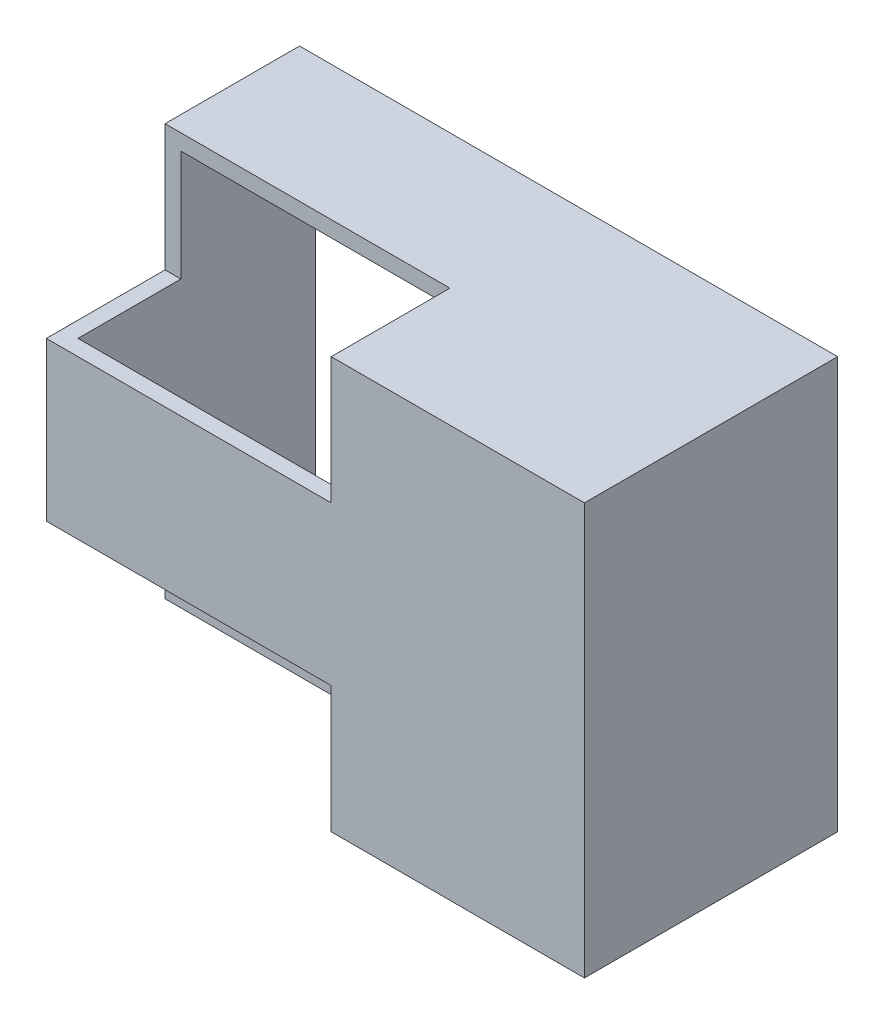
ISO-10303-21;
HEADER;
FILE_DESCRIPTION(('STEP AP214'),'2;1');
FILE_NAME('part.step','',(''),(''),'','','');
FILE_SCHEMA(('AUTOMOTIVE_DESIGN { 1 0 10303 214 1 1 1 1 }'));
ENDSEC;
DATA;
#1=APPLICATION_CONTEXT('core data for automotive mechanical design processes');
#2=APPLICATION_PROTOCOL_DEFINITION('international standard','automotive_design',2000,#1);
#3=PRODUCT_CONTEXT('',#1,'mechanical');
#4=PRODUCT('Part','Part','',(#3));
#5=PRODUCT_RELATED_PRODUCT_CATEGORY('part','',(#4));
#6=PRODUCT_DEFINITION_FORMATION('','',#4);
#7=PRODUCT_DEFINITION_CONTEXT('part definition',#1,'design');
#8=PRODUCT_DEFINITION('design','',#6,#7);
#9=PRODUCT_DEFINITION_SHAPE('','',#8);
#10=(LENGTH_UNIT() NAMED_UNIT(*) SI_UNIT(.MILLI.,.METRE.));
#11=(NAMED_UNIT(*) PLANE_ANGLE_UNIT() SI_UNIT($,.RADIAN.));
#12=(NAMED_UNIT(*) SI_UNIT($,.STERADIAN.) SOLID_ANGLE_UNIT());
#13=UNCERTAINTY_MEASURE_WITH_UNIT(LENGTH_MEASURE(1.E-05),#10,'distance_accuracy_value','');
#14=(GEOMETRIC_REPRESENTATION_CONTEXT(3) GLOBAL_UNCERTAINTY_ASSIGNED_CONTEXT((#13)) GLOBAL_UNIT_ASSIGNED_CONTEXT((#10,
#11,#12)) REPRESENTATION_CONTEXT('',''));
#15=CARTESIAN_POINT('',(0.,0.,0.));
#16=DIRECTION('',(0.,0.,1.));
#17=DIRECTION('',(1.,0.,0.));
#18=AXIS2_PLACEMENT_3D('',#15,#16,#17);
#19=CARTESIAN_POINT('',(43.18,33.02,40.64));
#20=DIRECTION('',(-1.,0.,0.));
#21=DIRECTION('',(0.,-1.,0.));
#22=AXIS2_PLACEMENT_3D('',#19,#20,#21);
#23=PLANE('',#22);
#24=DIRECTION('',(0.,1.,0.));
#25=VECTOR('',#24,1.);
#26=CARTESIAN_POINT('',(43.18,33.02,0.));
#27=LINE('',#26,#25);
#28=CARTESIAN_POINT('',(43.18,-33.02,0.));
#29=VERTEX_POINT('',#28);
#30=CARTESIAN_POINT('',(43.18,33.02,0.));
#31=VERTEX_POINT('',#30);
#32=EDGE_CURVE('E284',#29,#31,#27,.T.);
#33=ORIENTED_EDGE('',*,*,#32,.T.);
#34=DIRECTION('',(0.,0.,-1.));
#35=VECTOR('',#34,1.);
#36=CARTESIAN_POINT('',(43.18,33.02,40.64));
#37=LINE('',#36,#35);
#38=CARTESIAN_POINT('',(43.18,33.02,40.64));
#39=VERTEX_POINT('',#38);
#40=EDGE_CURVE('E185',#39,#31,#37,.T.);
#41=ORIENTED_EDGE('',*,*,#40,.F.);
#42=DIRECTION('',(0.,1.,0.));
#43=VECTOR('',#42,1.);
#44=CARTESIAN_POINT('',(43.18,33.02,40.64));
#45=LINE('',#44,#43);
#46=CARTESIAN_POINT('',(43.18,-33.02,40.64));
#47=VERTEX_POINT('',#46);
#48=EDGE_CURVE('E290',#47,#39,#45,.T.);
#49=ORIENTED_EDGE('',*,*,#48,.F.);
#50=DIRECTION('',(0.,0.,-1.));
#51=VECTOR('',#50,1.);
#52=CARTESIAN_POINT('',(43.18,-33.02,40.64));
#53=LINE('',#52,#51);
#54=EDGE_CURVE('E183',#47,#29,#53,.T.);
#55=ORIENTED_EDGE('',*,*,#54,.T.);
#56=EDGE_LOOP('',(#33,#41,#49,#55));
#57=FACE_BOUND('',#56,.T.);
#58=ADVANCED_FACE('F35',(#57),#23,.F.);
#59=CARTESIAN_POINT('',(-43.18,33.02,40.64));
#60=DIRECTION('',(0.,-1.,0.));
#61=DIRECTION('',(0.,0.,-1.));
#62=AXIS2_PLACEMENT_3D('',#59,#60,#61);
#63=PLANE('',#62);
#64=DIRECTION('',(-1.,0.,0.));
#65=VECTOR('',#64,1.);
#66=CARTESIAN_POINT('',(-43.18,33.02,21.59));
#67=LINE('',#66,#65);
#68=CARTESIAN_POINT('',(2.54000000000001,33.02,21.59));
#69=VERTEX_POINT('',#68);
#70=CARTESIAN_POINT('',(-43.18,33.02,21.59));
#71=VERTEX_POINT('',#70);
#72=EDGE_CURVE('E242',#69,#71,#67,.T.);
#73=ORIENTED_EDGE('',*,*,#72,.F.);
#74=DIRECTION('',(0.,0.,1.));
#75=VECTOR('',#74,1.);
#76=CARTESIAN_POINT('',(2.54000000000001,33.02,21.59));
#77=LINE('',#76,#75);
#78=CARTESIAN_POINT('',(2.54000000000001,33.02,40.64));
#79=VERTEX_POINT('',#78);
#80=EDGE_CURVE('E248',#69,#79,#77,.T.);
#81=ORIENTED_EDGE('',*,*,#80,.T.);
#82=DIRECTION('',(-1.,0.,0.));
#83=VECTOR('',#82,1.);
#84=CARTESIAN_POINT('',(-43.18,33.02,40.64));
#85=LINE('',#84,#83);
#86=EDGE_CURVE('E293',#39,#79,#85,.T.);
#87=ORIENTED_EDGE('',*,*,#86,.F.);
#88=ORIENTED_EDGE('',*,*,#40,.T.);
#89=DIRECTION('',(-1.,0.,0.));
#90=VECTOR('',#89,1.);
#91=CARTESIAN_POINT('',(-43.18,33.02,0.));
#92=LINE('',#91,#90);
#93=CARTESIAN_POINT('',(-43.18,33.02,0.));
#94=VERTEX_POINT('',#93);
#95=EDGE_CURVE('E303',#31,#94,#92,.T.);
#96=ORIENTED_EDGE('',*,*,#95,.T.);
#97=DIRECTION('',(0.,0.,-1.));
#98=VECTOR('',#97,1.);
#99=CARTESIAN_POINT('',(-43.18,33.02,40.64));
#100=LINE('',#99,#98);
#101=EDGE_CURVE('E182',#71,#94,#100,.T.);
#102=ORIENTED_EDGE('',*,*,#101,.F.);
#103=EDGE_LOOP('',(#73,#81,#87,#88,#96,#102));
#104=FACE_BOUND('',#103,.T.);
#105=ADVANCED_FACE('F316',(#104),#63,.F.);
#106=CARTESIAN_POINT('',(-43.18,33.02,40.64));
#107=DIRECTION('',(1.,0.,0.));
#108=DIRECTION('',(0.,1.,0.));
#109=AXIS2_PLACEMENT_3D('',#106,#107,#108);
#110=PLANE('',#109);
#111=DIRECTION('',(0.,-1.,0.));
#112=VECTOR('',#111,1.);
#113=CARTESIAN_POINT('',(-43.18,-33.02,21.59));
#114=LINE('',#113,#112);
#115=CARTESIAN_POINT('',(-43.18,-12.7,21.59));
#116=VERTEX_POINT('',#115);
#117=CARTESIAN_POINT('',(-43.18,-33.02,21.59));
#118=VERTEX_POINT('',#117);
#119=EDGE_CURVE('E158',#116,#118,#114,.T.);
#120=ORIENTED_EDGE('',*,*,#119,.F.);
#121=DIRECTION('',(0.,0.,1.));
#122=VECTOR('',#121,1.);
#123=CARTESIAN_POINT('',(-43.18,-12.7,21.59));
#124=LINE('',#123,#122);
#125=CARTESIAN_POINT('',(-43.18,-12.7,40.64));
#126=VERTEX_POINT('',#125);
#127=EDGE_CURVE('E222',#116,#126,#124,.T.);
#128=ORIENTED_EDGE('',*,*,#127,.T.);
#129=DIRECTION('',(0.,-1.,0.));
#130=VECTOR('',#129,1.);
#131=CARTESIAN_POINT('',(-43.18,33.02,40.64));
#132=LINE('',#131,#130);
#133=CARTESIAN_POINT('',(-43.18,12.7,40.64));
#134=VERTEX_POINT('',#133);
#135=EDGE_CURVE('E297',#134,#126,#132,.T.);
#136=ORIENTED_EDGE('',*,*,#135,.F.);
#137=DIRECTION('',(0.,0.,1.));
#138=VECTOR('',#137,1.);
#139=CARTESIAN_POINT('',(-43.18,12.7,21.59));
#140=LINE('',#139,#138);
#141=CARTESIAN_POINT('',(-43.18,12.7,21.59));
#142=VERTEX_POINT('',#141);
#143=EDGE_CURVE('E244',#142,#134,#140,.T.);
#144=ORIENTED_EDGE('',*,*,#143,.F.);
#145=DIRECTION('',(0.,-1.,0.));
#146=VECTOR('',#145,1.);
#147=CARTESIAN_POINT('',(-43.18,33.02,21.59));
#148=LINE('',#147,#146);
#149=EDGE_CURVE('E233',#71,#142,#148,.T.);
#150=ORIENTED_EDGE('',*,*,#149,.F.);
#151=ORIENTED_EDGE('',*,*,#101,.T.);
#152=DIRECTION('',(0.,-1.,0.));
#153=VECTOR('',#152,1.);
#154=CARTESIAN_POINT('',(-43.18,33.02,0.));
#155=LINE('',#154,#153);
#156=CARTESIAN_POINT('',(-43.18,-33.02,0.));
#157=VERTEX_POINT('',#156);
#158=EDGE_CURVE('E180',#94,#157,#155,.T.);
#159=ORIENTED_EDGE('',*,*,#158,.T.);
#160=DIRECTION('',(0.,0.,-1.));
#161=VECTOR('',#160,1.);
#162=CARTESIAN_POINT('',(-43.18,-33.02,40.64));
#163=LINE('',#162,#161);
#164=EDGE_CURVE('E174',#118,#157,#163,.T.);
#165=ORIENTED_EDGE('',*,*,#164,.F.);
#166=EDGE_LOOP('',(#120,#128,#136,#144,#150,#151,#159,#165));
#167=FACE_BOUND('',#166,.T.);
#168=ADVANCED_FACE('F178',(#167),#110,.F.);
#169=CARTESIAN_POINT('',(-43.18,-33.02,40.64));
#170=DIRECTION('',(0.,1.,0.));
#171=DIRECTION('',(0.,0.,1.));
#172=AXIS2_PLACEMENT_3D('',#169,#170,#171);
#173=PLANE('',#172);
#174=DIRECTION('',(1.,0.,0.));
#175=VECTOR('',#174,1.);
#176=CARTESIAN_POINT('',(-43.18,-33.02,40.64));
#177=LINE('',#176,#175);
#178=CARTESIAN_POINT('',(2.54000000000001,-33.02,40.64));
#179=VERTEX_POINT('',#178);
#180=EDGE_CURVE('E188',#179,#47,#177,.T.);
#181=ORIENTED_EDGE('',*,*,#180,.F.);
#182=DIRECTION('',(0.,0.,1.));
#183=VECTOR('',#182,1.);
#184=CARTESIAN_POINT('',(2.54000000000001,-33.02,21.59));
#185=LINE('',#184,#183);
#186=CARTESIAN_POINT('',(2.54000000000001,-33.02,21.59));
#187=VERTEX_POINT('',#186);
#188=EDGE_CURVE('E49',#187,#179,#185,.T.);
#189=ORIENTED_EDGE('',*,*,#188,.F.);
#190=DIRECTION('',(1.,0.,0.));
#191=VECTOR('',#190,1.);
#192=CARTESIAN_POINT('',(-43.18,-33.02,21.59));
#193=LINE('',#192,#191);
#194=EDGE_CURVE('E162',#118,#187,#193,.T.);
#195=ORIENTED_EDGE('',*,*,#194,.F.);
#196=ORIENTED_EDGE('',*,*,#164,.T.);
#197=DIRECTION('',(1.,0.,0.));
#198=VECTOR('',#197,1.);
#199=CARTESIAN_POINT('',(-43.18,-33.02,0.));
#200=LINE('',#199,#198);
#201=EDGE_CURVE('E294',#157,#29,#200,.T.);
#202=ORIENTED_EDGE('',*,*,#201,.T.);
#203=ORIENTED_EDGE('',*,*,#54,.F.);
#204=EDGE_LOOP('',(#181,#189,#195,#196,#202,#203));
#205=FACE_BOUND('',#204,.T.);
#206=ADVANCED_FACE('F173',(#205),#173,.F.);
#207=CARTESIAN_POINT('',(0.,0.,40.64));
#208=DIRECTION('',(0.,0.,1.));
#209=DIRECTION('',(1.,0.,0.));
#210=AXIS2_PLACEMENT_3D('',#207,#208,#209);
#211=PLANE('',#210);
#212=DIRECTION('',(-1.,0.,0.));
#213=VECTOR('',#212,1.);
#214=CARTESIAN_POINT('',(-43.18,-12.7,40.64));
#215=LINE('',#214,#213);
#216=CARTESIAN_POINT('',(2.54000000000001,-12.7,40.64));
#217=VERTEX_POINT('',#216);
#218=EDGE_CURVE('E169',#217,#126,#215,.T.);
#219=ORIENTED_EDGE('',*,*,#218,.F.);
#220=DIRECTION('',(0.,1.,0.));
#221=VECTOR('',#220,1.);
#222=CARTESIAN_POINT('',(2.54000000000001,-33.02,40.64));
#223=LINE('',#222,#221);
#224=EDGE_CURVE('E322',#179,#217,#223,.T.);
#225=ORIENTED_EDGE('',*,*,#224,.F.);
#226=ORIENTED_EDGE('',*,*,#180,.T.);
#227=ORIENTED_EDGE('',*,*,#48,.T.);
#228=ORIENTED_EDGE('',*,*,#86,.T.);
#229=DIRECTION('',(0.,1.,0.));
#230=VECTOR('',#229,1.);
#231=CARTESIAN_POINT('',(2.54000000000001,33.02,40.64));
#232=LINE('',#231,#230);
#233=CARTESIAN_POINT('',(2.54000000000001,12.7,40.64));
#234=VERTEX_POINT('',#233);
#235=EDGE_CURVE('E237',#234,#79,#232,.T.);
#236=ORIENTED_EDGE('',*,*,#235,.F.);
#237=DIRECTION('',(1.,0.,0.));
#238=VECTOR('',#237,1.);
#239=CARTESIAN_POINT('',(-43.18,12.7,40.64));
#240=LINE('',#239,#238);
#241=EDGE_CURVE('E232',#134,#234,#240,.T.);
#242=ORIENTED_EDGE('',*,*,#241,.F.);
#243=ORIENTED_EDGE('',*,*,#135,.T.);
#244=EDGE_LOOP('',(#219,#225,#226,#227,#228,#236,#242,#243));
#245=FACE_BOUND('',#244,.T.);
#246=ADVANCED_FACE('F321',(#245),#211,.T.);
#247=CARTESIAN_POINT('',(0.,0.,0.));
#248=DIRECTION('',(0.,0.,1.));
#249=DIRECTION('',(1.,0.,0.));
#250=AXIS2_PLACEMENT_3D('',#247,#248,#249);
#251=PLANE('',#250);
#252=DIRECTION('',(1.,0.,0.));
#253=VECTOR('',#252,1.);
#254=CARTESIAN_POINT('',(40.64,30.48,0.));
#255=LINE('',#254,#253);
#256=CARTESIAN_POINT('',(-40.64,30.48,0.));
#257=VERTEX_POINT('',#256);
#258=CARTESIAN_POINT('',(40.64,30.48,0.));
#259=VERTEX_POINT('',#258);
#260=EDGE_CURVE('E274',#257,#259,#255,.T.);
#261=ORIENTED_EDGE('',*,*,#260,.F.);
#262=DIRECTION('',(0.,1.,0.));
#263=VECTOR('',#262,1.);
#264=CARTESIAN_POINT('',(-40.64,30.48,0.));
#265=LINE('',#264,#263);
#266=CARTESIAN_POINT('',(-40.64,-30.48,0.));
#267=VERTEX_POINT('',#266);
#268=EDGE_CURVE('E262',#267,#257,#265,.T.);
#269=ORIENTED_EDGE('',*,*,#268,.F.);
#270=DIRECTION('',(-1.,0.,0.));
#271=VECTOR('',#270,1.);
#272=CARTESIAN_POINT('',(40.64,-30.48,0.));
#273=LINE('',#272,#271);
#274=CARTESIAN_POINT('',(40.64,-30.48,0.));
#275=VERTEX_POINT('',#274);
#276=EDGE_CURVE('E266',#275,#267,#273,.T.);
#277=ORIENTED_EDGE('',*,*,#276,.F.);
#278=DIRECTION('',(0.,-1.,0.));
#279=VECTOR('',#278,1.);
#280=CARTESIAN_POINT('',(40.64,30.48,0.));
#281=LINE('',#280,#279);
#282=EDGE_CURVE('E277',#259,#275,#281,.T.);
#283=ORIENTED_EDGE('',*,*,#282,.F.);
#284=EDGE_LOOP('',(#261,#269,#277,#283));
#285=FACE_BOUND('',#284,.T.);
#286=ORIENTED_EDGE('',*,*,#32,.F.);
#287=ORIENTED_EDGE('',*,*,#201,.F.);
#288=ORIENTED_EDGE('',*,*,#158,.F.);
#289=ORIENTED_EDGE('',*,*,#95,.F.);
#290=EDGE_LOOP('',(#286,#287,#288,#289));
#291=FACE_BOUND('',#290,.T.);
#292=ADVANCED_FACE('F312',(#285,#291),#251,.F.);
#293=CARTESIAN_POINT('',(-40.64,30.48,38.1));
#294=DIRECTION('',(-1.,0.,0.));
#295=DIRECTION('',(0.,-1.,0.));
#296=AXIS2_PLACEMENT_3D('',#293,#294,#295);
#297=PLANE('',#296);
#298=DIRECTION('',(0.,1.,0.));
#299=VECTOR('',#298,1.);
#300=CARTESIAN_POINT('',(-40.64,30.48,38.1));
#301=LINE('',#300,#299);
#302=CARTESIAN_POINT('',(-40.64,-12.7,38.1));
#303=VERTEX_POINT('',#302);
#304=CARTESIAN_POINT('',(-40.64,12.7,38.1));
#305=VERTEX_POINT('',#304);
#306=EDGE_CURVE('E263',#303,#305,#301,.T.);
#307=ORIENTED_EDGE('',*,*,#306,.F.);
#308=DIRECTION('',(0.,0.,-1.));
#309=VECTOR('',#308,1.);
#310=CARTESIAN_POINT('',(-40.64,-12.7,38.1));
#311=LINE('',#310,#309);
#312=CARTESIAN_POINT('',(-40.64,-12.7,21.59));
#313=VERTEX_POINT('',#312);
#314=EDGE_CURVE('E208',#303,#313,#311,.T.);
#315=ORIENTED_EDGE('',*,*,#314,.T.);
#316=DIRECTION('',(0.,-1.,0.));
#317=VECTOR('',#316,1.);
#318=CARTESIAN_POINT('',(-40.64,30.48,21.59));
#319=LINE('',#318,#317);
#320=CARTESIAN_POINT('',(-40.64,-30.48,21.59));
#321=VERTEX_POINT('',#320);
#322=EDGE_CURVE('E224',#313,#321,#319,.T.);
#323=ORIENTED_EDGE('',*,*,#322,.T.);
#324=DIRECTION('',(0.,0.,-1.));
#325=VECTOR('',#324,1.);
#326=CARTESIAN_POINT('',(-40.64,-30.48,38.1));
#327=LINE('',#326,#325);
#328=EDGE_CURVE('E282',#321,#267,#327,.T.);
#329=ORIENTED_EDGE('',*,*,#328,.T.);
#330=ORIENTED_EDGE('',*,*,#268,.T.);
#331=DIRECTION('',(0.,0.,-1.));
#332=VECTOR('',#331,1.);
#333=CARTESIAN_POINT('',(-40.64,30.48,38.1));
#334=LINE('',#333,#332);
#335=CARTESIAN_POINT('',(-40.64,30.48,21.59));
#336=VERTEX_POINT('',#335);
#337=EDGE_CURVE('E271',#336,#257,#334,.T.);
#338=ORIENTED_EDGE('',*,*,#337,.F.);
#339=DIRECTION('',(0.,1.,0.));
#340=VECTOR('',#339,1.);
#341=CARTESIAN_POINT('',(-40.64,30.48,21.59));
#342=LINE('',#341,#340);
#343=CARTESIAN_POINT('',(-40.64,12.7,21.59));
#344=VERTEX_POINT('',#343);
#345=EDGE_CURVE('E260',#344,#336,#342,.T.);
#346=ORIENTED_EDGE('',*,*,#345,.F.);
#347=DIRECTION('',(0.,0.,1.));
#348=VECTOR('',#347,1.);
#349=CARTESIAN_POINT('',(-40.64,12.7,38.1));
#350=LINE('',#349,#348);
#351=EDGE_CURVE('E251',#344,#305,#350,.T.);
#352=ORIENTED_EDGE('',*,*,#351,.T.);
#353=EDGE_LOOP('',(#307,#315,#323,#329,#330,#338,#346,#352));
#354=FACE_BOUND('',#353,.T.);
#355=ADVANCED_FACE('F328',(#354),#297,.F.);
#356=CARTESIAN_POINT('',(40.64,-30.48,38.1));
#357=DIRECTION('',(0.,-1.,0.));
#358=DIRECTION('',(0.,0.,-1.));
#359=AXIS2_PLACEMENT_3D('',#356,#357,#358);
#360=PLANE('',#359);
#361=DIRECTION('',(1.,0.,0.));
#362=VECTOR('',#361,1.);
#363=CARTESIAN_POINT('',(40.64,-30.48,21.59));
#364=LINE('',#363,#362);
#365=CARTESIAN_POINT('',(2.54000000000001,-30.48,21.59));
#366=VERTEX_POINT('',#365);
#367=EDGE_CURVE('E11',#321,#366,#364,.T.);
#368=ORIENTED_EDGE('',*,*,#367,.T.);
#369=DIRECTION('',(0.,0.,1.));
#370=VECTOR('',#369,1.);
#371=CARTESIAN_POINT('',(2.54000000000002,-30.48,38.1));
#372=LINE('',#371,#370);
#373=CARTESIAN_POINT('',(2.54000000000001,-30.48,38.1));
#374=VERTEX_POINT('',#373);
#375=EDGE_CURVE('E218',#366,#374,#372,.T.);
#376=ORIENTED_EDGE('',*,*,#375,.T.);
#377=DIRECTION('',(-1.,0.,0.));
#378=VECTOR('',#377,1.);
#379=CARTESIAN_POINT('',(40.64,-30.48,38.1));
#380=LINE('',#379,#378);
#381=CARTESIAN_POINT('',(40.64,-30.48,38.1));
#382=VERTEX_POINT('',#381);
#383=EDGE_CURVE('E215',#382,#374,#380,.T.);
#384=ORIENTED_EDGE('',*,*,#383,.F.);
#385=DIRECTION('',(0.,0.,-1.));
#386=VECTOR('',#385,1.);
#387=CARTESIAN_POINT('',(40.64,-30.48,38.1));
#388=LINE('',#387,#386);
#389=EDGE_CURVE('E285',#382,#275,#388,.T.);
#390=ORIENTED_EDGE('',*,*,#389,.T.);
#391=ORIENTED_EDGE('',*,*,#276,.T.);
#392=ORIENTED_EDGE('',*,*,#328,.F.);
#393=EDGE_LOOP('',(#368,#376,#384,#390,#391,#392));
#394=FACE_BOUND('',#393,.T.);
#395=ADVANCED_FACE('F220',(#394),#360,.F.);
#396=CARTESIAN_POINT('',(40.64,30.48,38.1));
#397=DIRECTION('',(1.,0.,0.));
#398=DIRECTION('',(0.,1.,0.));
#399=AXIS2_PLACEMENT_3D('',#396,#397,#398);
#400=PLANE('',#399);
#401=ORIENTED_EDGE('',*,*,#282,.T.);
#402=ORIENTED_EDGE('',*,*,#389,.F.);
#403=DIRECTION('',(0.,-1.,0.));
#404=VECTOR('',#403,1.);
#405=CARTESIAN_POINT('',(40.64,30.48,38.1));
#406=LINE('',#405,#404);
#407=CARTESIAN_POINT('',(40.64,30.48,38.1));
#408=VERTEX_POINT('',#407);
#409=EDGE_CURVE('E268',#408,#382,#406,.T.);
#410=ORIENTED_EDGE('',*,*,#409,.F.);
#411=DIRECTION('',(0.,0.,-1.));
#412=VECTOR('',#411,1.);
#413=CARTESIAN_POINT('',(40.64,30.48,38.1));
#414=LINE('',#413,#412);
#415=EDGE_CURVE('E287',#408,#259,#414,.T.);
#416=ORIENTED_EDGE('',*,*,#415,.T.);
#417=EDGE_LOOP('',(#401,#402,#410,#416));
#418=FACE_BOUND('',#417,.T.);
#419=ADVANCED_FACE('F356',(#418),#400,.F.);
#420=CARTESIAN_POINT('',(40.64,30.48,38.1));
#421=DIRECTION('',(0.,1.,0.));
#422=DIRECTION('',(0.,0.,1.));
#423=AXIS2_PLACEMENT_3D('',#420,#421,#422);
#424=PLANE('',#423);
#425=DIRECTION('',(1.,0.,0.));
#426=VECTOR('',#425,1.);
#427=CARTESIAN_POINT('',(40.64,30.48,38.1));
#428=LINE('',#427,#426);
#429=CARTESIAN_POINT('',(2.54000000000001,30.48,38.1));
#430=VERTEX_POINT('',#429);
#431=EDGE_CURVE('E265',#430,#408,#428,.T.);
#432=ORIENTED_EDGE('',*,*,#431,.F.);
#433=DIRECTION('',(0.,0.,-1.));
#434=VECTOR('',#433,1.);
#435=CARTESIAN_POINT('',(2.54000000000001,30.48,38.1));
#436=LINE('',#435,#434);
#437=CARTESIAN_POINT('',(2.54000000000001,30.48,21.59));
#438=VERTEX_POINT('',#437);
#439=EDGE_CURVE('E257',#430,#438,#436,.T.);
#440=ORIENTED_EDGE('',*,*,#439,.T.);
#441=DIRECTION('',(1.,0.,0.));
#442=VECTOR('',#441,1.);
#443=CARTESIAN_POINT('',(40.64,30.48,21.59));
#444=LINE('',#443,#442);
#445=EDGE_CURVE('E200',#336,#438,#444,.T.);
#446=ORIENTED_EDGE('',*,*,#445,.F.);
#447=ORIENTED_EDGE('',*,*,#337,.T.);
#448=ORIENTED_EDGE('',*,*,#260,.T.);
#449=ORIENTED_EDGE('',*,*,#415,.F.);
#450=EDGE_LOOP('',(#432,#440,#446,#447,#448,#449));
#451=FACE_BOUND('',#450,.T.);
#452=ADVANCED_FACE('F339',(#451),#424,.F.);
#453=CARTESIAN_POINT('',(0.,0.,38.1));
#454=DIRECTION('',(0.,0.,-1.));
#455=DIRECTION('',(-1.,0.,0.));
#456=AXIS2_PLACEMENT_3D('',#453,#454,#455);
#457=PLANE('',#456);
#458=DIRECTION('',(1.,0.,0.));
#459=VECTOR('',#458,1.);
#460=CARTESIAN_POINT('',(0.,-12.7,38.1));
#461=LINE('',#460,#459);
#462=CARTESIAN_POINT('',(2.54000000000001,-12.7,38.1));
#463=VERTEX_POINT('',#462);
#464=EDGE_CURVE('E42',#303,#463,#461,.T.);
#465=ORIENTED_EDGE('',*,*,#464,.F.);
#466=ORIENTED_EDGE('',*,*,#306,.T.);
#467=DIRECTION('',(-1.,0.,0.));
#468=VECTOR('',#467,1.);
#469=CARTESIAN_POINT('',(0.,12.7,38.1));
#470=LINE('',#469,#468);
#471=CARTESIAN_POINT('',(2.54000000000001,12.7,38.1));
#472=VERTEX_POINT('',#471);
#473=EDGE_CURVE('E194',#472,#305,#470,.T.);
#474=ORIENTED_EDGE('',*,*,#473,.F.);
#475=DIRECTION('',(0.,-1.,0.));
#476=VECTOR('',#475,1.);
#477=CARTESIAN_POINT('',(2.54000000000001,0.,38.1));
#478=LINE('',#477,#476);
#479=EDGE_CURVE('E197',#430,#472,#478,.T.);
#480=ORIENTED_EDGE('',*,*,#479,.F.);
#481=ORIENTED_EDGE('',*,*,#431,.T.);
#482=ORIENTED_EDGE('',*,*,#409,.T.);
#483=ORIENTED_EDGE('',*,*,#383,.T.);
#484=DIRECTION('',(0.,-1.,0.));
#485=VECTOR('',#484,1.);
#486=CARTESIAN_POINT('',(2.54000000000001,0.,38.1));
#487=LINE('',#486,#485);
#488=EDGE_CURVE('E202',#463,#374,#487,.T.);
#489=ORIENTED_EDGE('',*,*,#488,.F.);
#490=EDGE_LOOP('',(#465,#466,#474,#480,#481,#482,#483,#489));
#491=FACE_BOUND('',#490,.T.);
#492=ADVANCED_FACE('F212',(#491),#457,.T.);
#493=CARTESIAN_POINT('',(0.,0.,21.59));
#494=DIRECTION('',(0.,0.,1.));
#495=DIRECTION('',(1.,0.,0.));
#496=AXIS2_PLACEMENT_3D('',#493,#494,#495);
#497=PLANE('',#496);
#498=ORIENTED_EDGE('',*,*,#345,.T.);
#499=ORIENTED_EDGE('',*,*,#445,.T.);
#500=DIRECTION('',(0.,1.,0.));
#501=VECTOR('',#500,1.);
#502=CARTESIAN_POINT('',(2.54000000000001,33.02,21.59));
#503=LINE('',#502,#501);
#504=EDGE_CURVE('E240',#438,#69,#503,.T.);
#505=ORIENTED_EDGE('',*,*,#504,.T.);
#506=ORIENTED_EDGE('',*,*,#72,.T.);
#507=ORIENTED_EDGE('',*,*,#149,.T.);
#508=DIRECTION('',(1.,0.,0.));
#509=VECTOR('',#508,1.);
#510=CARTESIAN_POINT('',(-43.18,12.7,21.59));
#511=LINE('',#510,#509);
#512=EDGE_CURVE('E236',#142,#344,#511,.T.);
#513=ORIENTED_EDGE('',*,*,#512,.T.);
#514=EDGE_LOOP('',(#498,#499,#505,#506,#507,#513));
#515=FACE_BOUND('',#514,.T.);
#516=ADVANCED_FACE('F343',(#515),#497,.T.);
#517=CARTESIAN_POINT('',(2.54000000000001,33.02,21.59));
#518=DIRECTION('',(1.,0.,0.));
#519=DIRECTION('',(0.,1.,0.));
#520=AXIS2_PLACEMENT_3D('',#517,#518,#519);
#521=PLANE('',#520);
#522=ORIENTED_EDGE('',*,*,#479,.T.);
#523=DIRECTION('',(0.,0.,1.));
#524=VECTOR('',#523,1.);
#525=CARTESIAN_POINT('',(2.54000000000001,12.7,21.59));
#526=LINE('',#525,#524);
#527=EDGE_CURVE('E252',#472,#234,#526,.T.);
#528=ORIENTED_EDGE('',*,*,#527,.T.);
#529=ORIENTED_EDGE('',*,*,#235,.T.);
#530=ORIENTED_EDGE('',*,*,#80,.F.);
#531=ORIENTED_EDGE('',*,*,#504,.F.);
#532=ORIENTED_EDGE('',*,*,#439,.F.);
#533=EDGE_LOOP('',(#522,#528,#529,#530,#531,#532));
#534=FACE_BOUND('',#533,.T.);
#535=ADVANCED_FACE('F345',(#534),#521,.F.);
#536=CARTESIAN_POINT('',(-43.18,12.7,21.59));
#537=DIRECTION('',(0.,-1.,0.));
#538=DIRECTION('',(0.,0.,-1.));
#539=AXIS2_PLACEMENT_3D('',#536,#537,#538);
#540=PLANE('',#539);
#541=ORIENTED_EDGE('',*,*,#512,.F.);
#542=ORIENTED_EDGE('',*,*,#143,.T.);
#543=ORIENTED_EDGE('',*,*,#241,.T.);
#544=ORIENTED_EDGE('',*,*,#527,.F.);
#545=ORIENTED_EDGE('',*,*,#473,.T.);
#546=ORIENTED_EDGE('',*,*,#351,.F.);
#547=EDGE_LOOP('',(#541,#542,#543,#544,#545,#546));
#548=FACE_BOUND('',#547,.T.);
#549=ADVANCED_FACE('F352',(#548),#540,.F.);
#550=CARTESIAN_POINT('',(0.,0.,21.59));
#551=DIRECTION('',(0.,0.,-1.));
#552=DIRECTION('',(-1.,0.,0.));
#553=AXIS2_PLACEMENT_3D('',#550,#551,#552);
#554=PLANE('',#553);
#555=DIRECTION('',(-1.,0.,0.));
#556=VECTOR('',#555,1.);
#557=CARTESIAN_POINT('',(-43.18,-12.7,21.59));
#558=LINE('',#557,#556);
#559=EDGE_CURVE('E164',#313,#116,#558,.T.);
#560=ORIENTED_EDGE('',*,*,#559,.T.);
#561=ORIENTED_EDGE('',*,*,#119,.T.);
#562=ORIENTED_EDGE('',*,*,#194,.T.);
#563=DIRECTION('',(0.,1.,0.));
#564=VECTOR('',#563,1.);
#565=CARTESIAN_POINT('',(2.54000000000001,-33.02,21.59));
#566=LINE('',#565,#564);
#567=EDGE_CURVE('E176',#187,#366,#566,.T.);
#568=ORIENTED_EDGE('',*,*,#567,.T.);
#569=ORIENTED_EDGE('',*,*,#367,.F.);
#570=ORIENTED_EDGE('',*,*,#322,.F.);
#571=EDGE_LOOP('',(#560,#561,#562,#568,#569,#570));
#572=FACE_BOUND('',#571,.T.);
#573=ADVANCED_FACE('F160',(#572),#554,.F.);
#574=CARTESIAN_POINT('',(-43.18,-12.7,21.59));
#575=DIRECTION('',(0.,1.,0.));
#576=DIRECTION('',(0.,0.,1.));
#577=AXIS2_PLACEMENT_3D('',#574,#575,#576);
#578=PLANE('',#577);
#579=ORIENTED_EDGE('',*,*,#464,.T.);
#580=DIRECTION('',(0.,0.,1.));
#581=VECTOR('',#580,1.);
#582=CARTESIAN_POINT('',(2.54000000000001,-12.7,21.59));
#583=LINE('',#582,#581);
#584=EDGE_CURVE('E55',#463,#217,#583,.T.);
#585=ORIENTED_EDGE('',*,*,#584,.T.);
#586=ORIENTED_EDGE('',*,*,#218,.T.);
#587=ORIENTED_EDGE('',*,*,#127,.F.);
#588=ORIENTED_EDGE('',*,*,#559,.F.);
#589=ORIENTED_EDGE('',*,*,#314,.F.);
#590=EDGE_LOOP('',(#579,#585,#586,#587,#588,#589));
#591=FACE_BOUND('',#590,.T.);
#592=ADVANCED_FACE('F206',(#591),#578,.F.);
#593=CARTESIAN_POINT('',(2.54000000000001,-33.02,21.59));
#594=DIRECTION('',(1.,0.,0.));
#595=DIRECTION('',(0.,0.,-1.));
#596=AXIS2_PLACEMENT_3D('',#593,#594,#595);
#597=PLANE('',#596);
#598=ORIENTED_EDGE('',*,*,#567,.F.);
#599=ORIENTED_EDGE('',*,*,#188,.T.);
#600=ORIENTED_EDGE('',*,*,#224,.T.);
#601=ORIENTED_EDGE('',*,*,#584,.F.);
#602=ORIENTED_EDGE('',*,*,#488,.T.);
#603=ORIENTED_EDGE('',*,*,#375,.F.);
#604=EDGE_LOOP('',(#598,#599,#600,#601,#602,#603));
#605=FACE_BOUND('',#604,.T.);
#606=ADVANCED_FACE('F217',(#605),#597,.F.);
#607=CLOSED_SHELL('',(#58,#105,#168,#206,#246,#292,#355,#395,#419,#452,#492,#516,#535,#549,#573,
#592,#606));
#608=MANIFOLD_SOLID_BREP('B2',#607);
#609=ADVANCED_BREP_SHAPE_REPRESENTATION('',(#18,#608),#14);
#610=SHAPE_DEFINITION_REPRESENTATION(#9,#609);
ENDSEC;
END-ISO-10303-21;
